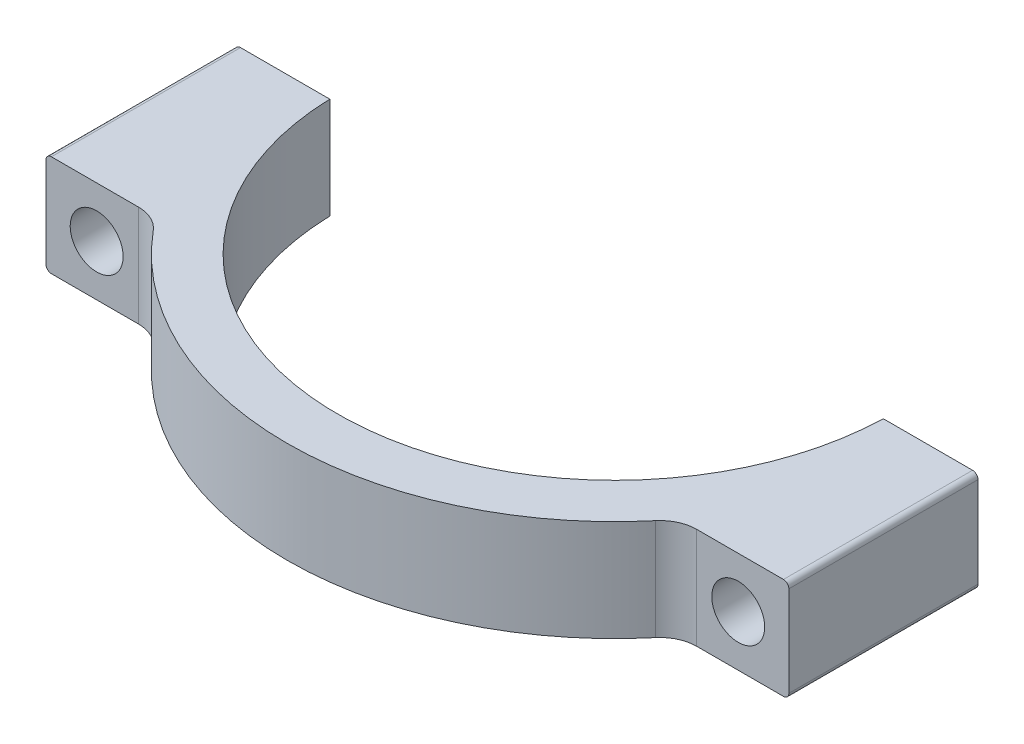
ISO-10303-21;
HEADER;
FILE_DESCRIPTION(('STEP AP214'),'2;1');
FILE_NAME('part.step','',(''),(''),'','','');
FILE_SCHEMA(('AUTOMOTIVE_DESIGN { 1 0 10303 214 1 1 1 1 }'));
ENDSEC;
DATA;
#1=APPLICATION_CONTEXT('core data for automotive mechanical design processes');
#2=APPLICATION_PROTOCOL_DEFINITION('international standard','automotive_design',2000,#1);
#3=PRODUCT_CONTEXT('',#1,'mechanical');
#4=PRODUCT('Part','Part','',(#3));
#5=PRODUCT_RELATED_PRODUCT_CATEGORY('part','',(#4));
#6=PRODUCT_DEFINITION_FORMATION('','',#4);
#7=PRODUCT_DEFINITION_CONTEXT('part definition',#1,'design');
#8=PRODUCT_DEFINITION('design','',#6,#7);
#9=PRODUCT_DEFINITION_SHAPE('','',#8);
#10=(LENGTH_UNIT() NAMED_UNIT(*) SI_UNIT(.MILLI.,.METRE.));
#11=(NAMED_UNIT(*) PLANE_ANGLE_UNIT() SI_UNIT($,.RADIAN.));
#12=(NAMED_UNIT(*) SI_UNIT($,.STERADIAN.) SOLID_ANGLE_UNIT());
#13=UNCERTAINTY_MEASURE_WITH_UNIT(LENGTH_MEASURE(1.E-05),#10,'distance_accuracy_value','');
#14=(GEOMETRIC_REPRESENTATION_CONTEXT(3) GLOBAL_UNCERTAINTY_ASSIGNED_CONTEXT((#13)) GLOBAL_UNIT_ASSIGNED_CONTEXT((#10,
#11,#12)) REPRESENTATION_CONTEXT('',''));
#15=CARTESIAN_POINT('',(0.,0.,0.));
#16=DIRECTION('',(0.,0.,1.));
#17=DIRECTION('',(1.,0.,0.));
#18=AXIS2_PLACEMENT_3D('',#15,#16,#17);
#19=CARTESIAN_POINT('',(34.925,4.7625,0.));
#20=DIRECTION('',(-1.,0.,0.));
#21=DIRECTION('',(0.,0.,1.));
#22=AXIS2_PLACEMENT_3D('',#19,#20,#21);
#23=PLANE('',#22);
#24=DIRECTION('',(0.,-1.,0.));
#25=VECTOR('',#24,1.);
#26=CARTESIAN_POINT('',(34.925,4.7625,-30.0355));
#27=LINE('',#26,#25);
#28=CARTESIAN_POINT('',(34.925,4.2545,-30.0355));
#29=VERTEX_POINT('',#28);
#30=CARTESIAN_POINT('',(34.925,-4.2545,-30.0355));
#31=VERTEX_POINT('',#30);
#32=EDGE_CURVE('E187',#29,#31,#27,.T.);
#33=ORIENTED_EDGE('',*,*,#32,.F.);
#34=DIRECTION('',(0.,0.,-1.));
#35=VECTOR('',#34,1.);
#36=CARTESIAN_POINT('',(34.925,4.2545,-12.2555));
#37=LINE('',#36,#35);
#38=CARTESIAN_POINT('',(34.925,4.2545,-12.2555));
#39=VERTEX_POINT('',#38);
#40=EDGE_CURVE('E66',#29,#39,#37,.F.);
#41=ORIENTED_EDGE('',*,*,#40,.T.);
#42=DIRECTION('',(0.,-1.,0.));
#43=VECTOR('',#42,1.);
#44=CARTESIAN_POINT('',(34.925,4.7625,-12.2555));
#45=LINE('',#44,#43);
#46=CARTESIAN_POINT('',(34.925,-4.2545,-12.2555));
#47=VERTEX_POINT('',#46);
#48=EDGE_CURVE('E256',#39,#47,#45,.T.);
#49=ORIENTED_EDGE('',*,*,#48,.T.);
#50=DIRECTION('',(0.,0.,-1.));
#51=VECTOR('',#50,1.);
#52=CARTESIAN_POINT('',(34.925,-4.2545,0.));
#53=LINE('',#52,#51);
#54=EDGE_CURVE('E319',#47,#31,#53,.T.);
#55=ORIENTED_EDGE('',*,*,#54,.T.);
#56=EDGE_LOOP('',(#33,#41,#49,#55));
#57=FACE_BOUND('',#56,.T.);
#58=ADVANCED_FACE('F45',(#57),#23,.F.);
#59=CARTESIAN_POINT('',(0.,4.7625,-30.7975));
#60=DIRECTION('',(0.,1.,0.));
#61=DIRECTION('',(0.,0.,1.));
#62=AXIS2_PLACEMENT_3D('',#59,#60,#61);
#63=PLANE('',#62);
#64=DIRECTION('',(-1.,0.,0.));
#65=VECTOR('',#64,1.);
#66=CARTESIAN_POINT('',(-26.0238463913388,4.7625,-30.0355));
#67=LINE('',#66,#65);
#68=CARTESIAN_POINT('',(-26.0238463913388,4.7625,-30.0355));
#69=VERTEX_POINT('',#68);
#70=CARTESIAN_POINT('',(-34.417,4.7625,-30.0355));
#71=VERTEX_POINT('',#70);
#72=EDGE_CURVE('E146',#69,#71,#67,.T.);
#73=ORIENTED_EDGE('',*,*,#72,.T.);
#74=DIRECTION('',(0.,0.,1.));
#75=VECTOR('',#74,1.);
#76=CARTESIAN_POINT('',(-34.417,4.7625,-12.2555));
#77=LINE('',#76,#75);
#78=CARTESIAN_POINT('',(-34.417,4.7625,-12.2555));
#79=VERTEX_POINT('',#78);
#80=EDGE_CURVE('E293',#71,#79,#77,.T.);
#81=ORIENTED_EDGE('',*,*,#80,.T.);
#82=DIRECTION('',(1.,0.,0.));
#83=VECTOR('',#82,1.);
#84=CARTESIAN_POINT('',(-24.5902468928232,4.7625,-12.2555));
#85=LINE('',#84,#83);
#86=CARTESIAN_POINT('',(-26.2436365858469,4.7625,-12.2555));
#87=VERTEX_POINT('',#86);
#88=EDGE_CURVE('E245',#79,#87,#85,.T.);
#89=ORIENTED_EDGE('',*,*,#88,.T.);
#90=CARTESIAN_POINT('',(-26.2436365858469,4.7625,-8.8265));
#91=DIRECTION('',(0.,1.,0.));
#92=DIRECTION('',(0.,0.,1.));
#93=AXIS2_PLACEMENT_3D('',#90,#91,#92);
#94=CIRCLE('',#93,3.429);
#95=CARTESIAN_POINT('',(-23.6144039779884,4.7625,-11.0276762523191));
#96=VERTEX_POINT('',#95);
#97=EDGE_CURVE('E289',#87,#96,#94,.F.);
#98=ORIENTED_EDGE('',*,*,#97,.T.);
#99=CARTESIAN_POINT('',(0.,4.7625,-30.7975));
#100=DIRECTION('',(0.,1.,0.));
#101=DIRECTION('',(0.,0.,-1.));
#102=AXIS2_PLACEMENT_3D('',#99,#100,#101);
#103=CIRCLE('',#102,30.7975);
#104=CARTESIAN_POINT('',(23.6144039779884,4.7625,-11.0276762523191));
#105=VERTEX_POINT('',#104);
#106=EDGE_CURVE('E248',#96,#105,#103,.T.);
#107=ORIENTED_EDGE('',*,*,#106,.T.);
#108=CARTESIAN_POINT('',(26.2436365858469,4.7625,-8.8265));
#109=DIRECTION('',(0.,1.,0.));
#110=DIRECTION('',(0.,0.,1.));
#111=AXIS2_PLACEMENT_3D('',#108,#109,#110);
#112=CIRCLE('',#111,3.429);
#113=CARTESIAN_POINT('',(26.2436365858469,4.7625,-12.2555));
#114=VERTEX_POINT('',#113);
#115=EDGE_CURVE('E269',#105,#114,#112,.F.);
#116=ORIENTED_EDGE('',*,*,#115,.T.);
#117=DIRECTION('',(-1.,0.,0.));
#118=VECTOR('',#117,1.);
#119=CARTESIAN_POINT('',(24.5902468928232,4.7625,-12.2555));
#120=LINE('',#119,#118);
#121=CARTESIAN_POINT('',(34.417,4.7625,-12.2555));
#122=VERTEX_POINT('',#121);
#123=EDGE_CURVE('E258',#122,#114,#120,.T.);
#124=ORIENTED_EDGE('',*,*,#123,.F.);
#125=DIRECTION('',(0.,0.,-1.));
#126=VECTOR('',#125,1.);
#127=CARTESIAN_POINT('',(34.417,4.7625,-30.0355));
#128=LINE('',#127,#126);
#129=CARTESIAN_POINT('',(34.417,4.7625,-30.0355));
#130=VERTEX_POINT('',#129);
#131=EDGE_CURVE('E291',#122,#130,#128,.T.);
#132=ORIENTED_EDGE('',*,*,#131,.T.);
#133=DIRECTION('',(-1.,0.,0.));
#134=VECTOR('',#133,1.);
#135=CARTESIAN_POINT('',(34.925,4.7625,-30.0355));
#136=LINE('',#135,#134);
#137=CARTESIAN_POINT('',(26.0238463913388,4.7625,-30.0355));
#138=VERTEX_POINT('',#137);
#139=EDGE_CURVE('E160',#130,#138,#136,.T.);
#140=ORIENTED_EDGE('',*,*,#139,.T.);
#141=CARTESIAN_POINT('',(0.,4.7625,-30.7975));
#142=DIRECTION('',(0.,-1.,0.));
#143=DIRECTION('',(0.,0.,1.));
#144=AXIS2_PLACEMENT_3D('',#141,#142,#143);
#145=CIRCLE('',#144,26.035);
#146=EDGE_CURVE('E161',#138,#69,#145,.T.);
#147=ORIENTED_EDGE('',*,*,#146,.T.);
#148=EDGE_LOOP('',(#73,#81,#89,#98,#107,#116,#124,#132,#140,#147));
#149=FACE_BOUND('',#148,.T.);
#150=ADVANCED_FACE('F164',(#149),#63,.T.);
#151=CARTESIAN_POINT('',(0.,-4.7625,-30.7975));
#152=DIRECTION('',(0.,1.,0.));
#153=DIRECTION('',(0.,0.,1.));
#154=AXIS2_PLACEMENT_3D('',#151,#152,#153);
#155=PLANE('',#154);
#156=DIRECTION('',(1.,0.,0.));
#157=VECTOR('',#156,1.);
#158=CARTESIAN_POINT('',(-24.5902468928232,-4.7625,-12.2555));
#159=LINE('',#158,#157);
#160=CARTESIAN_POINT('',(-34.417,-4.7625,-12.2555));
#161=VERTEX_POINT('',#160);
#162=CARTESIAN_POINT('',(-26.2436365858469,-4.7625,-12.2555));
#163=VERTEX_POINT('',#162);
#164=EDGE_CURVE('E246',#161,#163,#159,.T.);
#165=ORIENTED_EDGE('',*,*,#164,.F.);
#166=DIRECTION('',(0.,0.,1.));
#167=VECTOR('',#166,1.);
#168=CARTESIAN_POINT('',(-34.417,-4.7625,-30.7975));
#169=LINE('',#168,#167);
#170=CARTESIAN_POINT('',(-34.417,-4.7625,-30.0355));
#171=VERTEX_POINT('',#170);
#172=EDGE_CURVE('E311',#161,#171,#169,.F.);
#173=ORIENTED_EDGE('',*,*,#172,.T.);
#174=DIRECTION('',(-1.,0.,0.));
#175=VECTOR('',#174,1.);
#176=CARTESIAN_POINT('',(-26.0238463913388,-4.7625,-30.0355));
#177=LINE('',#176,#175);
#178=CARTESIAN_POINT('',(-26.0238463913388,-4.7625,-30.0355));
#179=VERTEX_POINT('',#178);
#180=EDGE_CURVE('E218',#179,#171,#177,.T.);
#181=ORIENTED_EDGE('',*,*,#180,.F.);
#182=CARTESIAN_POINT('',(0.,-4.7625,-30.7975));
#183=DIRECTION('',(0.,-1.,0.));
#184=DIRECTION('',(0.,0.,1.));
#185=AXIS2_PLACEMENT_3D('',#182,#183,#184);
#186=CIRCLE('',#185,26.035);
#187=CARTESIAN_POINT('',(26.0238463913388,-4.7625,-30.0355));
#188=VERTEX_POINT('',#187);
#189=EDGE_CURVE('E175',#188,#179,#186,.T.);
#190=ORIENTED_EDGE('',*,*,#189,.F.);
#191=DIRECTION('',(-1.,0.,0.));
#192=VECTOR('',#191,1.);
#193=CARTESIAN_POINT('',(34.925,-4.7625,-30.0355));
#194=LINE('',#193,#192);
#195=CARTESIAN_POINT('',(34.417,-4.7625,-30.0355));
#196=VERTEX_POINT('',#195);
#197=EDGE_CURVE('E171',#196,#188,#194,.T.);
#198=ORIENTED_EDGE('',*,*,#197,.F.);
#199=DIRECTION('',(0.,0.,-1.));
#200=VECTOR('',#199,1.);
#201=CARTESIAN_POINT('',(34.417,-4.7625,-30.7975));
#202=LINE('',#201,#200);
#203=CARTESIAN_POINT('',(34.417,-4.7625,-12.2555));
#204=VERTEX_POINT('',#203);
#205=EDGE_CURVE('E309',#196,#204,#202,.F.);
#206=ORIENTED_EDGE('',*,*,#205,.T.);
#207=DIRECTION('',(-1.,0.,0.));
#208=VECTOR('',#207,1.);
#209=CARTESIAN_POINT('',(24.5902468928232,-4.7625,-12.2555));
#210=LINE('',#209,#208);
#211=CARTESIAN_POINT('',(26.2436365858469,-4.7625,-12.2555));
#212=VERTEX_POINT('',#211);
#213=EDGE_CURVE('E259',#204,#212,#210,.T.);
#214=ORIENTED_EDGE('',*,*,#213,.T.);
#215=CARTESIAN_POINT('',(26.2436365858469,-4.7625,-8.8265));
#216=DIRECTION('',(0.,1.,0.));
#217=DIRECTION('',(0.,0.,1.));
#218=AXIS2_PLACEMENT_3D('',#215,#216,#217);
#219=CIRCLE('',#218,3.429);
#220=CARTESIAN_POINT('',(23.6144039779884,-4.7625,-11.0276762523191));
#221=VERTEX_POINT('',#220);
#222=EDGE_CURVE('E274',#212,#221,#219,.T.);
#223=ORIENTED_EDGE('',*,*,#222,.T.);
#224=CARTESIAN_POINT('',(0.,-4.7625,-30.7975));
#225=DIRECTION('',(0.,1.,0.));
#226=DIRECTION('',(0.,0.,-1.));
#227=AXIS2_PLACEMENT_3D('',#224,#225,#226);
#228=CIRCLE('',#227,30.7975);
#229=CARTESIAN_POINT('',(-23.6144039779884,-4.7625,-11.0276762523191));
#230=VERTEX_POINT('',#229);
#231=EDGE_CURVE('E249',#230,#221,#228,.T.);
#232=ORIENTED_EDGE('',*,*,#231,.F.);
#233=CARTESIAN_POINT('',(-26.2436365858469,-4.7625,-8.8265));
#234=DIRECTION('',(0.,1.,0.));
#235=DIRECTION('',(0.,0.,1.));
#236=AXIS2_PLACEMENT_3D('',#233,#234,#235);
#237=CIRCLE('',#236,3.429);
#238=EDGE_CURVE('E273',#230,#163,#237,.T.);
#239=ORIENTED_EDGE('',*,*,#238,.T.);
#240=EDGE_LOOP('',(#165,#173,#181,#190,#198,#206,#214,#223,#232,#239));
#241=FACE_BOUND('',#240,.T.);
#242=ADVANCED_FACE('F334',(#241),#155,.F.);
#243=CARTESIAN_POINT('',(30.1625,0.,-30.0355));
#244=DIRECTION('',(0.,0.,-1.));
#245=DIRECTION('',(-1.,0.,0.));
#246=AXIS2_PLACEMENT_3D('',#243,#244,#245);
#247=CYLINDRICAL_SURFACE('',#246,2.48919999999999);
#248=CARTESIAN_POINT('',(30.1625,0.,-30.0355));
#249=DIRECTION('',(0.,0.,-1.));
#250=DIRECTION('',(-1.,0.,0.));
#251=AXIS2_PLACEMENT_3D('',#248,#249,#250);
#252=CIRCLE('',#251,2.4892);
#253=CARTESIAN_POINT('',(27.6733,0.,-30.0355));
#254=VERTEX_POINT('',#253);
#255=EDGE_CURVE('E239',#254,#254,#252,.T.);
#256=ORIENTED_EDGE('',*,*,#255,.T.);
#257=EDGE_LOOP('',(#256));
#258=FACE_BOUND('',#257,.T.);
#259=CARTESIAN_POINT('',(30.1625,0.,-12.2555));
#260=DIRECTION('',(0.,0.,1.));
#261=DIRECTION('',(1.,0.,0.));
#262=AXIS2_PLACEMENT_3D('',#259,#260,#261);
#263=CIRCLE('',#262,2.48919999999999);
#264=CARTESIAN_POINT('',(32.6517,0.,-12.2555));
#265=VERTEX_POINT('',#264);
#266=EDGE_CURVE('E252',#265,#265,#263,.F.);
#267=ORIENTED_EDGE('',*,*,#266,.F.);
#268=EDGE_LOOP('',(#267));
#269=FACE_BOUND('',#268,.T.);
#270=ADVANCED_FACE('F361',(#258,#269),#247,.F.);
#271=CARTESIAN_POINT('',(0.,4.7625,-30.7975));
#272=DIRECTION('',(0.,-1.,0.));
#273=DIRECTION('',(0.,0.,-1.));
#274=AXIS2_PLACEMENT_3D('',#271,#272,#273);
#275=CYLINDRICAL_SURFACE('',#274,26.035);
#276=ORIENTED_EDGE('',*,*,#189,.T.);
#277=DIRECTION('',(0.,-1.,0.));
#278=VECTOR('',#277,1.);
#279=CARTESIAN_POINT('',(-26.0238463913388,4.7625,-30.0355));
#280=LINE('',#279,#278);
#281=EDGE_CURVE('E152',#69,#179,#280,.T.);
#282=ORIENTED_EDGE('',*,*,#281,.F.);
#283=ORIENTED_EDGE('',*,*,#146,.F.);
#284=DIRECTION('',(0.,-1.,0.));
#285=VECTOR('',#284,1.);
#286=CARTESIAN_POINT('',(26.0238463913388,4.7625,-30.0355));
#287=LINE('',#286,#285);
#288=EDGE_CURVE('E203',#138,#188,#287,.T.);
#289=ORIENTED_EDGE('',*,*,#288,.T.);
#290=EDGE_LOOP('',(#276,#282,#283,#289));
#291=FACE_BOUND('',#290,.T.);
#292=ADVANCED_FACE('F173',(#291),#275,.F.);
#293=CARTESIAN_POINT('',(-26.0238463913388,4.7625,-30.0355));
#294=DIRECTION('',(0.,0.,1.));
#295=DIRECTION('',(1.,0.,0.));
#296=AXIS2_PLACEMENT_3D('',#293,#294,#295);
#297=PLANE('',#296);
#298=CARTESIAN_POINT('',(-30.1625,0.,-30.0355));
#299=DIRECTION('',(0.,0.,-1.));
#300=DIRECTION('',(-1.,0.,0.));
#301=AXIS2_PLACEMENT_3D('',#298,#299,#300);
#302=CIRCLE('',#301,2.4892);
#303=CARTESIAN_POINT('',(-32.6517,0.,-30.0355));
#304=VERTEX_POINT('',#303);
#305=EDGE_CURVE('E219',#304,#304,#302,.T.);
#306=ORIENTED_EDGE('',*,*,#305,.F.);
#307=EDGE_LOOP('',(#306));
#308=FACE_BOUND('',#307,.T.);
#309=DIRECTION('',(0.,-1.,0.));
#310=VECTOR('',#309,1.);
#311=CARTESIAN_POINT('',(-34.925,4.7625,-30.0355));
#312=LINE('',#311,#310);
#313=CARTESIAN_POINT('',(-34.925,4.2545,-30.0355));
#314=VERTEX_POINT('',#313);
#315=CARTESIAN_POINT('',(-34.925,-4.2545,-30.0355));
#316=VERTEX_POINT('',#315);
#317=EDGE_CURVE('E178',#314,#316,#312,.T.);
#318=ORIENTED_EDGE('',*,*,#317,.F.);
#319=CARTESIAN_POINT('',(-34.417,4.2545,-30.0355));
#320=DIRECTION('',(0.,0.,1.));
#321=DIRECTION('',(1.,0.,0.));
#322=AXIS2_PLACEMENT_3D('',#319,#320,#321);
#323=CIRCLE('',#322,0.508);
#324=EDGE_CURVE('E155',#314,#71,#323,.F.);
#325=ORIENTED_EDGE('',*,*,#324,.T.);
#326=ORIENTED_EDGE('',*,*,#72,.F.);
#327=ORIENTED_EDGE('',*,*,#281,.T.);
#328=ORIENTED_EDGE('',*,*,#180,.T.);
#329=CARTESIAN_POINT('',(-34.417,-4.2545,-30.0355));
#330=DIRECTION('',(0.,0.,1.));
#331=DIRECTION('',(1.,0.,0.));
#332=AXIS2_PLACEMENT_3D('',#329,#330,#331);
#333=CIRCLE('',#332,0.508);
#334=EDGE_CURVE('E304',#171,#316,#333,.F.);
#335=ORIENTED_EDGE('',*,*,#334,.T.);
#336=EDGE_LOOP('',(#318,#325,#326,#327,#328,#335));
#337=FACE_BOUND('',#336,.T.);
#338=ADVANCED_FACE('F149',(#308,#337),#297,.F.);
#339=CARTESIAN_POINT('',(-34.925,4.7625,-30.0355));
#340=DIRECTION('',(1.,0.,0.));
#341=DIRECTION('',(0.,0.,-1.));
#342=AXIS2_PLACEMENT_3D('',#339,#340,#341);
#343=PLANE('',#342);
#344=DIRECTION('',(0.,-1.,0.));
#345=VECTOR('',#344,1.);
#346=CARTESIAN_POINT('',(-34.925,4.7625,-12.2555));
#347=LINE('',#346,#345);
#348=CARTESIAN_POINT('',(-34.925,4.2545,-12.2555));
#349=VERTEX_POINT('',#348);
#350=CARTESIAN_POINT('',(-34.925,-4.2545,-12.2555));
#351=VERTEX_POINT('',#350);
#352=EDGE_CURVE('E242',#349,#351,#347,.T.);
#353=ORIENTED_EDGE('',*,*,#352,.F.);
#354=DIRECTION('',(0.,0.,1.));
#355=VECTOR('',#354,1.);
#356=CARTESIAN_POINT('',(-34.925,4.2545,-30.0355));
#357=LINE('',#356,#355);
#358=EDGE_CURVE('E302',#349,#314,#357,.F.);
#359=ORIENTED_EDGE('',*,*,#358,.T.);
#360=ORIENTED_EDGE('',*,*,#317,.T.);
#361=DIRECTION('',(0.,0.,1.));
#362=VECTOR('',#361,1.);
#363=CARTESIAN_POINT('',(-34.925,-4.2545,-30.0355));
#364=LINE('',#363,#362);
#365=EDGE_CURVE('E299',#316,#351,#364,.T.);
#366=ORIENTED_EDGE('',*,*,#365,.T.);
#367=EDGE_LOOP('',(#353,#359,#360,#366));
#368=FACE_BOUND('',#367,.T.);
#369=ADVANCED_FACE('F342',(#368),#343,.F.);
#370=CARTESIAN_POINT('',(34.925,4.7625,-30.0355));
#371=DIRECTION('',(0.,0.,1.));
#372=DIRECTION('',(1.,0.,0.));
#373=AXIS2_PLACEMENT_3D('',#370,#371,#372);
#374=PLANE('',#373);
#375=ORIENTED_EDGE('',*,*,#255,.F.);
#376=EDGE_LOOP('',(#375));
#377=FACE_BOUND('',#376,.T.);
#378=ORIENTED_EDGE('',*,*,#139,.F.);
#379=CARTESIAN_POINT('',(34.417,4.2545,-30.0355));
#380=DIRECTION('',(0.,0.,1.));
#381=DIRECTION('',(1.,0.,0.));
#382=AXIS2_PLACEMENT_3D('',#379,#380,#381);
#383=CIRCLE('',#382,0.508);
#384=EDGE_CURVE('E316',#130,#29,#383,.F.);
#385=ORIENTED_EDGE('',*,*,#384,.T.);
#386=ORIENTED_EDGE('',*,*,#32,.T.);
#387=CARTESIAN_POINT('',(34.417,-4.2545,-30.0355));
#388=DIRECTION('',(0.,0.,1.));
#389=DIRECTION('',(1.,0.,0.));
#390=AXIS2_PLACEMENT_3D('',#387,#388,#389);
#391=CIRCLE('',#390,0.508);
#392=EDGE_CURVE('E313',#31,#196,#391,.F.);
#393=ORIENTED_EDGE('',*,*,#392,.T.);
#394=ORIENTED_EDGE('',*,*,#197,.T.);
#395=ORIENTED_EDGE('',*,*,#288,.F.);
#396=EDGE_LOOP('',(#378,#385,#386,#393,#394,#395));
#397=FACE_BOUND('',#396,.T.);
#398=ADVANCED_FACE('F326',(#377,#397),#374,.F.);
#399=CARTESIAN_POINT('',(-30.1625,0.,-30.0355));
#400=DIRECTION('',(0.,0.,-1.));
#401=DIRECTION('',(-1.,0.,0.));
#402=AXIS2_PLACEMENT_3D('',#399,#400,#401);
#403=CYLINDRICAL_SURFACE('',#402,2.4892);
#404=CARTESIAN_POINT('',(-30.1625,0.,-12.2555));
#405=DIRECTION('',(0.,0.,-1.));
#406=DIRECTION('',(-1.,0.,0.));
#407=AXIS2_PLACEMENT_3D('',#404,#405,#406);
#408=CIRCLE('',#407,2.4892);
#409=CARTESIAN_POINT('',(-32.6517,0.,-12.2555));
#410=VERTEX_POINT('',#409);
#411=EDGE_CURVE('E193',#410,#410,#408,.F.);
#412=ORIENTED_EDGE('',*,*,#411,.T.);
#413=EDGE_LOOP('',(#412));
#414=FACE_BOUND('',#413,.T.);
#415=ORIENTED_EDGE('',*,*,#305,.T.);
#416=EDGE_LOOP('',(#415));
#417=FACE_BOUND('',#416,.T.);
#418=ADVANCED_FACE('F440',(#414,#417),#403,.F.);
#419=CARTESIAN_POINT('',(-24.5902468928232,4.7625,-12.2555));
#420=DIRECTION('',(0.,0.,-1.));
#421=DIRECTION('',(-1.,0.,0.));
#422=AXIS2_PLACEMENT_3D('',#419,#420,#421);
#423=PLANE('',#422);
#424=ORIENTED_EDGE('',*,*,#88,.F.);
#425=CARTESIAN_POINT('',(-34.417,4.2545,-12.2555));
#426=DIRECTION('',(0.,0.,-1.));
#427=DIRECTION('',(-1.,0.,0.));
#428=AXIS2_PLACEMENT_3D('',#425,#426,#427);
#429=CIRCLE('',#428,0.508);
#430=EDGE_CURVE('E297',#79,#349,#429,.F.);
#431=ORIENTED_EDGE('',*,*,#430,.T.);
#432=ORIENTED_EDGE('',*,*,#352,.T.);
#433=CARTESIAN_POINT('',(-34.417,-4.2545,-12.2555));
#434=DIRECTION('',(0.,0.,-1.));
#435=DIRECTION('',(-1.,0.,0.));
#436=AXIS2_PLACEMENT_3D('',#433,#434,#435);
#437=CIRCLE('',#436,0.508);
#438=EDGE_CURVE('E295',#351,#161,#437,.F.);
#439=ORIENTED_EDGE('',*,*,#438,.T.);
#440=ORIENTED_EDGE('',*,*,#164,.T.);
#441=DIRECTION('',(0.,1.,0.));
#442=VECTOR('',#441,1.);
#443=CARTESIAN_POINT('',(-26.2436365858469,4.7625,-12.2555));
#444=LINE('',#443,#442);
#445=EDGE_CURVE('E281',#163,#87,#444,.T.);
#446=ORIENTED_EDGE('',*,*,#445,.T.);
#447=EDGE_LOOP('',(#424,#431,#432,#439,#440,#446));
#448=FACE_BOUND('',#447,.T.);
#449=ORIENTED_EDGE('',*,*,#411,.F.);
#450=EDGE_LOOP('',(#449));
#451=FACE_BOUND('',#450,.T.);
#452=ADVANCED_FACE('F346',(#448,#451),#423,.F.);
#453=CARTESIAN_POINT('',(0.,4.7625,-30.7975));
#454=DIRECTION('',(0.,-1.,0.));
#455=DIRECTION('',(0.,0.,-1.));
#456=AXIS2_PLACEMENT_3D('',#453,#454,#455);
#457=CYLINDRICAL_SURFACE('',#456,30.7975);
#458=ORIENTED_EDGE('',*,*,#231,.T.);
#459=DIRECTION('',(0.,-1.,0.));
#460=VECTOR('',#459,1.);
#461=CARTESIAN_POINT('',(23.6144039779884,4.7625,-11.0276762523191));
#462=LINE('',#461,#460);
#463=EDGE_CURVE('E278',#221,#105,#462,.F.);
#464=ORIENTED_EDGE('',*,*,#463,.T.);
#465=ORIENTED_EDGE('',*,*,#106,.F.);
#466=DIRECTION('',(0.,-1.,0.));
#467=VECTOR('',#466,1.);
#468=CARTESIAN_POINT('',(-23.6144039779884,4.7625,-11.0276762523191));
#469=LINE('',#468,#467);
#470=EDGE_CURVE('E183',#96,#230,#469,.T.);
#471=ORIENTED_EDGE('',*,*,#470,.T.);
#472=EDGE_LOOP('',(#458,#464,#465,#471));
#473=FACE_BOUND('',#472,.T.);
#474=ADVANCED_FACE('F428',(#473),#457,.T.);
#475=CARTESIAN_POINT('',(24.5902468928232,4.7625,-12.2555));
#476=DIRECTION('',(0.,0.,1.));
#477=DIRECTION('',(1.,0.,0.));
#478=AXIS2_PLACEMENT_3D('',#475,#476,#477);
#479=PLANE('',#478);
#480=ORIENTED_EDGE('',*,*,#48,.F.);
#481=CARTESIAN_POINT('',(34.417,4.2545,-12.2555));
#482=DIRECTION('',(0.,0.,1.));
#483=DIRECTION('',(1.,0.,0.));
#484=AXIS2_PLACEMENT_3D('',#481,#482,#483);
#485=CIRCLE('',#484,0.508);
#486=EDGE_CURVE('E12',#39,#122,#485,.T.);
#487=ORIENTED_EDGE('',*,*,#486,.T.);
#488=ORIENTED_EDGE('',*,*,#123,.T.);
#489=DIRECTION('',(0.,-1.,0.));
#490=VECTOR('',#489,1.);
#491=CARTESIAN_POINT('',(26.2436365858469,4.7625,-12.2555));
#492=LINE('',#491,#490);
#493=EDGE_CURVE('E177',#114,#212,#492,.T.);
#494=ORIENTED_EDGE('',*,*,#493,.T.);
#495=ORIENTED_EDGE('',*,*,#213,.F.);
#496=CARTESIAN_POINT('',(34.417,-4.2545,-12.2555));
#497=DIRECTION('',(0.,0.,1.));
#498=DIRECTION('',(1.,0.,0.));
#499=AXIS2_PLACEMENT_3D('',#496,#497,#498);
#500=CIRCLE('',#499,0.508);
#501=EDGE_CURVE('E53',#204,#47,#500,.T.);
#502=ORIENTED_EDGE('',*,*,#501,.T.);
#503=EDGE_LOOP('',(#480,#487,#488,#494,#495,#502));
#504=FACE_BOUND('',#503,.T.);
#505=ORIENTED_EDGE('',*,*,#266,.T.);
#506=EDGE_LOOP('',(#505));
#507=FACE_BOUND('',#506,.T.);
#508=ADVANCED_FACE('F263',(#504,#507),#479,.T.);
#509=CARTESIAN_POINT('',(26.2436365858469,4.7625,-8.8265));
#510=DIRECTION('',(0.,-1.,0.));
#511=DIRECTION('',(0.,0.,-1.));
#512=AXIS2_PLACEMENT_3D('',#509,#510,#511);
#513=CYLINDRICAL_SURFACE('',#512,3.429);
#514=ORIENTED_EDGE('',*,*,#115,.F.);
#515=ORIENTED_EDGE('',*,*,#463,.F.);
#516=ORIENTED_EDGE('',*,*,#222,.F.);
#517=ORIENTED_EDGE('',*,*,#493,.F.);
#518=EDGE_LOOP('',(#514,#515,#516,#517));
#519=FACE_BOUND('',#518,.T.);
#520=ADVANCED_FACE('F277',(#519),#513,.F.);
#521=CARTESIAN_POINT('',(-26.2436365858469,4.7625,-8.8265));
#522=DIRECTION('',(0.,-1.,0.));
#523=DIRECTION('',(0.,0.,-1.));
#524=AXIS2_PLACEMENT_3D('',#521,#522,#523);
#525=CYLINDRICAL_SURFACE('',#524,3.429);
#526=ORIENTED_EDGE('',*,*,#97,.F.);
#527=ORIENTED_EDGE('',*,*,#445,.F.);
#528=ORIENTED_EDGE('',*,*,#238,.F.);
#529=ORIENTED_EDGE('',*,*,#470,.F.);
#530=EDGE_LOOP('',(#526,#527,#528,#529));
#531=FACE_BOUND('',#530,.T.);
#532=ADVANCED_FACE('F354',(#531),#525,.F.);
#533=CARTESIAN_POINT('',(-34.417,4.2545,-30.7975));
#534=DIRECTION('',(0.,0.,-1.));
#535=DIRECTION('',(-1.,0.,0.));
#536=AXIS2_PLACEMENT_3D('',#533,#534,#535);
#537=CYLINDRICAL_SURFACE('',#536,0.508);
#538=ORIENTED_EDGE('',*,*,#324,.F.);
#539=ORIENTED_EDGE('',*,*,#358,.F.);
#540=ORIENTED_EDGE('',*,*,#430,.F.);
#541=ORIENTED_EDGE('',*,*,#80,.F.);
#542=EDGE_LOOP('',(#538,#539,#540,#541));
#543=FACE_BOUND('',#542,.T.);
#544=ADVANCED_FACE('F349',(#543),#537,.T.);
#545=CARTESIAN_POINT('',(-34.417,-4.2545,-30.0355));
#546=DIRECTION('',(0.,0.,1.));
#547=DIRECTION('',(1.,0.,0.));
#548=AXIS2_PLACEMENT_3D('',#545,#546,#547);
#549=CYLINDRICAL_SURFACE('',#548,0.508);
#550=ORIENTED_EDGE('',*,*,#334,.F.);
#551=ORIENTED_EDGE('',*,*,#172,.F.);
#552=ORIENTED_EDGE('',*,*,#438,.F.);
#553=ORIENTED_EDGE('',*,*,#365,.F.);
#554=EDGE_LOOP('',(#550,#551,#552,#553));
#555=FACE_BOUND('',#554,.T.);
#556=ADVANCED_FACE('F339',(#555),#549,.T.);
#557=CARTESIAN_POINT('',(34.417,4.2545,-30.7975));
#558=DIRECTION('',(0.,0.,1.));
#559=DIRECTION('',(1.,0.,0.));
#560=AXIS2_PLACEMENT_3D('',#557,#558,#559);
#561=CYLINDRICAL_SURFACE('',#560,0.508);
#562=ORIENTED_EDGE('',*,*,#486,.F.);
#563=ORIENTED_EDGE('',*,*,#40,.F.);
#564=ORIENTED_EDGE('',*,*,#384,.F.);
#565=ORIENTED_EDGE('',*,*,#131,.F.);
#566=EDGE_LOOP('',(#562,#563,#564,#565));
#567=FACE_BOUND('',#566,.T.);
#568=ADVANCED_FACE('F393',(#567),#561,.T.);
#569=CARTESIAN_POINT('',(34.417,-4.2545,0.));
#570=DIRECTION('',(0.,0.,-1.));
#571=DIRECTION('',(-1.,0.,0.));
#572=AXIS2_PLACEMENT_3D('',#569,#570,#571);
#573=CYLINDRICAL_SURFACE('',#572,0.508);
#574=ORIENTED_EDGE('',*,*,#501,.F.);
#575=ORIENTED_EDGE('',*,*,#205,.F.);
#576=ORIENTED_EDGE('',*,*,#392,.F.);
#577=ORIENTED_EDGE('',*,*,#54,.F.);
#578=EDGE_LOOP('',(#574,#575,#576,#577));
#579=FACE_BOUND('',#578,.T.);
#580=ADVANCED_FACE('F47',(#579),#573,.T.);
#581=CLOSED_SHELL('',(#58,#150,#242,#270,#292,#338,#369,#398,#418,#452,#474,#508,#520,#532,#544,
#556,#568,#580));
#582=MANIFOLD_SOLID_BREP('B2',#581);
#583=ADVANCED_BREP_SHAPE_REPRESENTATION('',(#18,#582),#14);
#584=SHAPE_DEFINITION_REPRESENTATION(#9,#583);
ENDSEC;
END-ISO-10303-21;
